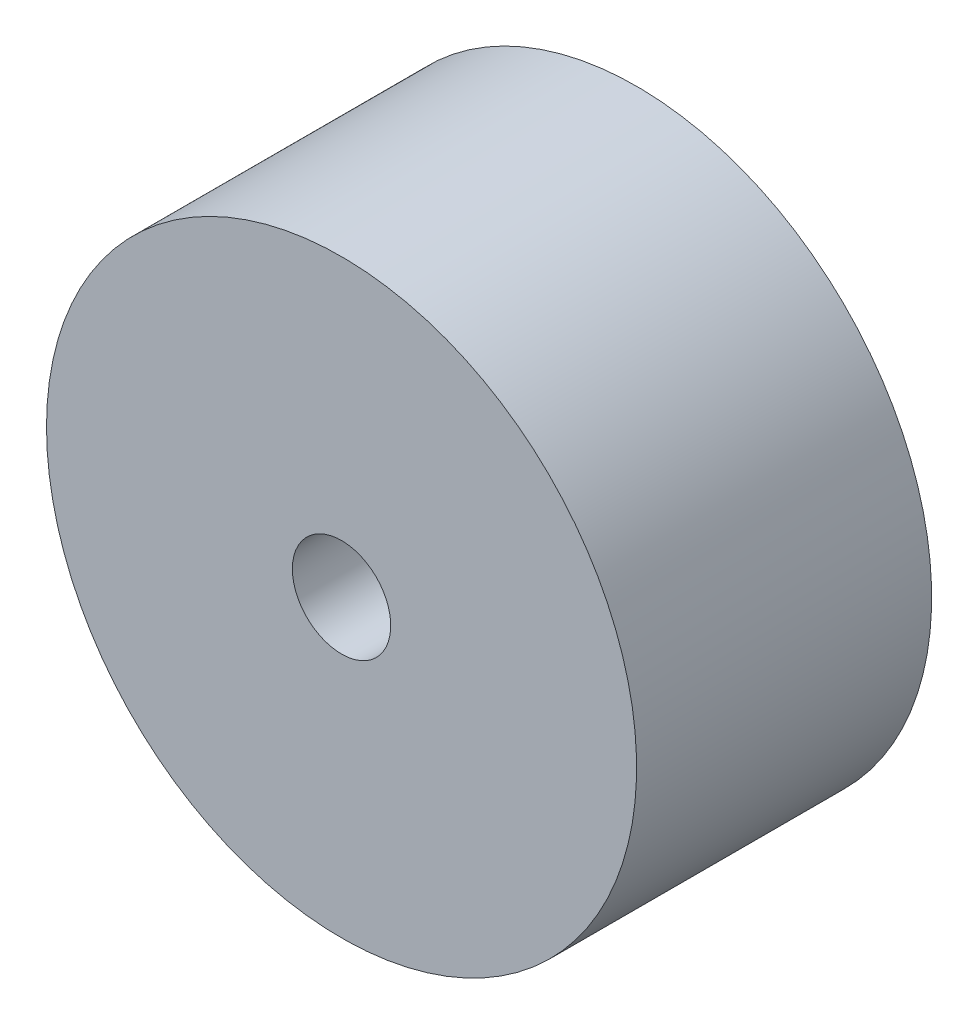
ISO-10303-21;
HEADER;
FILE_DESCRIPTION(('STEP AP214'),'2;1');
FILE_NAME('part.step','',(''),(''),'','','');
FILE_SCHEMA(('AUTOMOTIVE_DESIGN { 1 0 10303 214 1 1 1 1 }'));
ENDSEC;
DATA;
#1=APPLICATION_CONTEXT('core data for automotive mechanical design processes');
#2=APPLICATION_PROTOCOL_DEFINITION('international standard','automotive_design',2000,#1);
#3=PRODUCT_CONTEXT('',#1,'mechanical');
#4=PRODUCT('Part','Part','',(#3));
#5=PRODUCT_RELATED_PRODUCT_CATEGORY('part','',(#4));
#6=PRODUCT_DEFINITION_FORMATION('','',#4);
#7=PRODUCT_DEFINITION_CONTEXT('part definition',#1,'design');
#8=PRODUCT_DEFINITION('design','',#6,#7);
#9=PRODUCT_DEFINITION_SHAPE('','',#8);
#10=(LENGTH_UNIT() NAMED_UNIT(*) SI_UNIT(.MILLI.,.METRE.));
#11=(NAMED_UNIT(*) PLANE_ANGLE_UNIT() SI_UNIT($,.RADIAN.));
#12=(NAMED_UNIT(*) SI_UNIT($,.STERADIAN.) SOLID_ANGLE_UNIT());
#13=UNCERTAINTY_MEASURE_WITH_UNIT(LENGTH_MEASURE(1.E-05),#10,'distance_accuracy_value','');
#14=(GEOMETRIC_REPRESENTATION_CONTEXT(3) GLOBAL_UNCERTAINTY_ASSIGNED_CONTEXT((#13)) GLOBAL_UNIT_ASSIGNED_CONTEXT((#10,
#11,#12)) REPRESENTATION_CONTEXT('',''));
#15=CARTESIAN_POINT('',(0.,0.,0.));
#16=DIRECTION('',(0.,0.,1.));
#17=DIRECTION('',(1.,0.,0.));
#18=AXIS2_PLACEMENT_3D('',#15,#16,#17);
#19=CARTESIAN_POINT('',(0.,0.,38.1));
#20=DIRECTION('',(0.,0.,1.));
#21=DIRECTION('',(1.,0.,0.));
#22=AXIS2_PLACEMENT_3D('',#19,#20,#21);
#23=PLANE('',#22);
#24=CARTESIAN_POINT('',(0.,0.,38.1));
#25=DIRECTION('',(0.,0.,1.));
#26=DIRECTION('',(1.,0.,0.));
#27=AXIS2_PLACEMENT_3D('',#24,#25,#26);
#28=CIRCLE('',#27,38.1);
#29=CARTESIAN_POINT('',(-38.1,0.,38.1));
#30=VERTEX_POINT('',#29);
#31=EDGE_CURVE('E10',#30,#30,#28,.T.);
#32=ORIENTED_EDGE('',*,*,#31,.T.);
#33=EDGE_LOOP('',(#32));
#34=FACE_BOUND('',#33,.T.);
#35=CARTESIAN_POINT('',(0.,0.,38.1));
#36=DIRECTION('',(0.,0.,1.));
#37=DIRECTION('',(1.,0.,0.));
#38=AXIS2_PLACEMENT_3D('',#35,#36,#37);
#39=CIRCLE('',#38,6.35);
#40=CARTESIAN_POINT('',(-6.35,0.,38.1));
#41=VERTEX_POINT('',#40);
#42=EDGE_CURVE('E47',#41,#41,#39,.T.);
#43=ORIENTED_EDGE('',*,*,#42,.F.);
#44=EDGE_LOOP('',(#43));
#45=FACE_BOUND('',#44,.T.);
#46=ADVANCED_FACE('F36',(#34,#45),#23,.T.);
#47=CARTESIAN_POINT('',(0.,0.,0.));
#48=DIRECTION('',(0.,0.,1.));
#49=DIRECTION('',(1.,0.,0.));
#50=AXIS2_PLACEMENT_3D('',#47,#48,#49);
#51=PLANE('',#50);
#52=CARTESIAN_POINT('',(0.,0.,0.));
#53=DIRECTION('',(0.,0.,1.));
#54=DIRECTION('',(1.,0.,0.));
#55=AXIS2_PLACEMENT_3D('',#52,#53,#54);
#56=CIRCLE('',#55,38.1);
#57=CARTESIAN_POINT('',(-38.1,0.,0.));
#58=VERTEX_POINT('',#57);
#59=EDGE_CURVE('E40',#58,#58,#56,.T.);
#60=ORIENTED_EDGE('',*,*,#59,.F.);
#61=EDGE_LOOP('',(#60));
#62=FACE_BOUND('',#61,.T.);
#63=CARTESIAN_POINT('',(0.,0.,0.));
#64=DIRECTION('',(0.,0.,1.));
#65=DIRECTION('',(1.,0.,0.));
#66=AXIS2_PLACEMENT_3D('',#63,#64,#65);
#67=CIRCLE('',#66,6.35);
#68=CARTESIAN_POINT('',(-6.35,0.,0.));
#69=VERTEX_POINT('',#68);
#70=EDGE_CURVE('E49',#69,#69,#67,.T.);
#71=ORIENTED_EDGE('',*,*,#70,.T.);
#72=EDGE_LOOP('',(#71));
#73=FACE_BOUND('',#72,.T.);
#74=ADVANCED_FACE('F59',(#62,#73),#51,.F.);
#75=CARTESIAN_POINT('',(0.,0.,38.1));
#76=DIRECTION('',(0.,0.,-1.));
#77=DIRECTION('',(-1.,0.,0.));
#78=AXIS2_PLACEMENT_3D('',#75,#76,#77);
#79=CYLINDRICAL_SURFACE('',#78,38.1);
#80=CARTESIAN_POINT('',(-38.1,0.,38.1));
#81=CARTESIAN_POINT('',(-38.1,0.,37.703125));
#82=CARTESIAN_POINT('',(-38.1,0.,37.30625));
#83=CARTESIAN_POINT('',(-38.1,0.,36.5125));
#84=CARTESIAN_POINT('',(-38.1,0.,36.115625));
#85=CARTESIAN_POINT('',(-38.1,0.,35.321875));
#86=CARTESIAN_POINT('',(-38.1,0.,34.925));
#87=CARTESIAN_POINT('',(-38.1,0.,34.13125));
#88=CARTESIAN_POINT('',(-38.1,0.,33.734375));
#89=CARTESIAN_POINT('',(-38.1,0.,32.940625));
#90=CARTESIAN_POINT('',(-38.1,0.,32.54375));
#91=CARTESIAN_POINT('',(-38.1,0.,31.75));
#92=CARTESIAN_POINT('',(-38.1,0.,31.353125));
#93=CARTESIAN_POINT('',(-38.1,0.,30.559375));
#94=CARTESIAN_POINT('',(-38.1,0.,30.1625));
#95=CARTESIAN_POINT('',(-38.1,0.,29.36875));
#96=CARTESIAN_POINT('',(-38.1,0.,28.971875));
#97=CARTESIAN_POINT('',(-38.1,0.,28.178125));
#98=CARTESIAN_POINT('',(-38.1,0.,27.78125));
#99=CARTESIAN_POINT('',(-38.1,0.,26.9875));
#100=CARTESIAN_POINT('',(-38.1,0.,26.590625));
#101=CARTESIAN_POINT('',(-38.1,0.,25.796875));
#102=CARTESIAN_POINT('',(-38.1,0.,25.4));
#103=CARTESIAN_POINT('',(-38.1,0.,24.60625));
#104=CARTESIAN_POINT('',(-38.1,0.,24.209375));
#105=CARTESIAN_POINT('',(-38.1,0.,23.415625));
#106=CARTESIAN_POINT('',(-38.1,0.,23.01875));
#107=CARTESIAN_POINT('',(-38.1,0.,22.225));
#108=CARTESIAN_POINT('',(-38.1,0.,21.828125));
#109=CARTESIAN_POINT('',(-38.1,0.,21.034375));
#110=CARTESIAN_POINT('',(-38.1,0.,20.6375));
#111=CARTESIAN_POINT('',(-38.1,0.,19.84375));
#112=CARTESIAN_POINT('',(-38.1,0.,19.446875));
#113=CARTESIAN_POINT('',(-38.1,0.,18.653125));
#114=CARTESIAN_POINT('',(-38.1,0.,18.25625));
#115=CARTESIAN_POINT('',(-38.1,0.,17.4625));
#116=CARTESIAN_POINT('',(-38.1,0.,17.065625));
#117=CARTESIAN_POINT('',(-38.1,0.,16.271875));
#118=CARTESIAN_POINT('',(-38.1,0.,15.875));
#119=CARTESIAN_POINT('',(-38.1,0.,15.08125));
#120=CARTESIAN_POINT('',(-38.1,0.,14.684375));
#121=CARTESIAN_POINT('',(-38.1,0.,13.890625));
#122=CARTESIAN_POINT('',(-38.1,0.,13.49375));
#123=CARTESIAN_POINT('',(-38.1,0.,12.7));
#124=CARTESIAN_POINT('',(-38.1,0.,12.303125));
#125=CARTESIAN_POINT('',(-38.1,0.,11.509375));
#126=CARTESIAN_POINT('',(-38.1,0.,11.1125));
#127=CARTESIAN_POINT('',(-38.1,0.,10.31875));
#128=CARTESIAN_POINT('',(-38.1,0.,9.92187499999999));
#129=CARTESIAN_POINT('',(-38.1,0.,9.128125));
#130=CARTESIAN_POINT('',(-38.1,0.,8.73124999999999));
#131=CARTESIAN_POINT('',(-38.1,0.,7.93749999999999));
#132=CARTESIAN_POINT('',(-38.1,0.,7.54062499999999));
#133=CARTESIAN_POINT('',(-38.1,0.,6.746875));
#134=CARTESIAN_POINT('',(-38.1,0.,6.35));
#135=CARTESIAN_POINT('',(-38.1,0.,5.55625));
#136=CARTESIAN_POINT('',(-38.1,0.,5.159375));
#137=CARTESIAN_POINT('',(-38.1,0.,4.365625));
#138=CARTESIAN_POINT('',(-38.1,0.,3.96875));
#139=CARTESIAN_POINT('',(-38.1,0.,3.175));
#140=CARTESIAN_POINT('',(-38.1,0.,2.778125));
#141=CARTESIAN_POINT('',(-38.1,0.,1.984375));
#142=CARTESIAN_POINT('',(-38.1,0.,1.5875));
#143=CARTESIAN_POINT('',(-38.1,0.,0.79375));
#144=CARTESIAN_POINT('',(-38.1,0.,0.396875));
#145=CARTESIAN_POINT('',(-38.1,0.,0.));
#146=B_SPLINE_CURVE_WITH_KNOTS('',3,(#80,#81,#82,#83,#84,#85,#86,#87,#88,#89,#90,#91,#92,#93,
#94,#95,#96,#97,#98,#99,#100,#101,#102,#103,#104,#105,#106,#107,#108,#109,#110,#111,#112,#113,
#114,#115,#116,#117,#118,#119,#120,#121,#122,#123,#124,#125,#126,#127,#128,#129,#130,#131,#132,
#133,#134,#135,#136,#137,#138,#139,#140,#141,#142,#143,#144,#145),.UNSPECIFIED.,.F.,.F.,(4,2,2,
2,2,2,2,2,2,2,2,2,2,2,2,2,2,2,2,2,2,2,2,2,2,2,2,2,2,2,2,2,4),(0.,1.190625,2.38125,3.571875,
4.7625,5.953125,7.14375,8.334375,9.52500000000001,10.715625,11.90625,13.096875,14.2875,
15.478125,16.66875,17.859375,19.05,20.240625,21.43125,22.621875,23.8125,25.003125,26.19375,
27.384375,28.575,29.765625,30.95625,32.146875,33.3375,34.528125,35.71875,36.909375,38.1),.UNSPECIFIED.);
#147=EDGE_CURVE('BSEAM38',#30,#58,#146,.T.);
#148=ORIENTED_EDGE('',*,*,#31,.F.);
#149=ORIENTED_EDGE('',*,*,#59,.T.);
#150=ORIENTED_EDGE('',*,*,#147,.T.);
#151=ORIENTED_EDGE('',*,*,#147,.F.);
#152=EDGE_LOOP('',(#148,#150,#149,#151));
#153=FACE_BOUND('',#152,.T.);
#154=ADVANCED_FACE('F38',(#153),#79,.T.);
#155=CARTESIAN_POINT('',(0.,0.,38.1));
#156=DIRECTION('',(0.,0.,-1.));
#157=DIRECTION('',(-1.,0.,0.));
#158=AXIS2_PLACEMENT_3D('',#155,#156,#157);
#159=CYLINDRICAL_SURFACE('',#158,6.35);
#160=CARTESIAN_POINT('',(-6.35,0.,38.1));
#161=CARTESIAN_POINT('',(-6.35,0.,37.703125));
#162=CARTESIAN_POINT('',(-6.35,0.,37.30625));
#163=CARTESIAN_POINT('',(-6.35,0.,36.5125));
#164=CARTESIAN_POINT('',(-6.35,0.,36.115625));
#165=CARTESIAN_POINT('',(-6.35,0.,35.321875));
#166=CARTESIAN_POINT('',(-6.35,0.,34.925));
#167=CARTESIAN_POINT('',(-6.35,0.,34.13125));
#168=CARTESIAN_POINT('',(-6.35,0.,33.734375));
#169=CARTESIAN_POINT('',(-6.35,0.,32.940625));
#170=CARTESIAN_POINT('',(-6.35,0.,32.54375));
#171=CARTESIAN_POINT('',(-6.35,0.,31.75));
#172=CARTESIAN_POINT('',(-6.35,0.,31.353125));
#173=CARTESIAN_POINT('',(-6.35,0.,30.559375));
#174=CARTESIAN_POINT('',(-6.35,0.,30.1625));
#175=CARTESIAN_POINT('',(-6.35,0.,29.36875));
#176=CARTESIAN_POINT('',(-6.35,0.,28.971875));
#177=CARTESIAN_POINT('',(-6.35,0.,28.178125));
#178=CARTESIAN_POINT('',(-6.35,0.,27.78125));
#179=CARTESIAN_POINT('',(-6.35,0.,26.9875));
#180=CARTESIAN_POINT('',(-6.35,0.,26.590625));
#181=CARTESIAN_POINT('',(-6.35,0.,25.796875));
#182=CARTESIAN_POINT('',(-6.35,0.,25.4));
#183=CARTESIAN_POINT('',(-6.35,0.,24.60625));
#184=CARTESIAN_POINT('',(-6.35,0.,24.209375));
#185=CARTESIAN_POINT('',(-6.35,0.,23.415625));
#186=CARTESIAN_POINT('',(-6.35,0.,23.01875));
#187=CARTESIAN_POINT('',(-6.35,0.,22.225));
#188=CARTESIAN_POINT('',(-6.35,0.,21.828125));
#189=CARTESIAN_POINT('',(-6.35,0.,21.034375));
#190=CARTESIAN_POINT('',(-6.35,0.,20.6375));
#191=CARTESIAN_POINT('',(-6.35,0.,19.84375));
#192=CARTESIAN_POINT('',(-6.35,0.,19.446875));
#193=CARTESIAN_POINT('',(-6.35,0.,18.653125));
#194=CARTESIAN_POINT('',(-6.35,0.,18.25625));
#195=CARTESIAN_POINT('',(-6.35,0.,17.4625));
#196=CARTESIAN_POINT('',(-6.35,0.,17.065625));
#197=CARTESIAN_POINT('',(-6.35,0.,16.271875));
#198=CARTESIAN_POINT('',(-6.35,0.,15.875));
#199=CARTESIAN_POINT('',(-6.35,0.,15.08125));
#200=CARTESIAN_POINT('',(-6.35,0.,14.684375));
#201=CARTESIAN_POINT('',(-6.35,0.,13.890625));
#202=CARTESIAN_POINT('',(-6.35,0.,13.49375));
#203=CARTESIAN_POINT('',(-6.35,0.,12.7));
#204=CARTESIAN_POINT('',(-6.35,0.,12.303125));
#205=CARTESIAN_POINT('',(-6.35,0.,11.509375));
#206=CARTESIAN_POINT('',(-6.35,0.,11.1125));
#207=CARTESIAN_POINT('',(-6.35,0.,10.31875));
#208=CARTESIAN_POINT('',(-6.35,0.,9.921875));
#209=CARTESIAN_POINT('',(-6.35,0.,9.128125));
#210=CARTESIAN_POINT('',(-6.35,0.,8.73125));
#211=CARTESIAN_POINT('',(-6.35,0.,7.9375));
#212=CARTESIAN_POINT('',(-6.35,0.,7.540625));
#213=CARTESIAN_POINT('',(-6.35,0.,6.746875));
#214=CARTESIAN_POINT('',(-6.35,0.,6.35));
#215=CARTESIAN_POINT('',(-6.35,0.,5.55625));
#216=CARTESIAN_POINT('',(-6.35,0.,5.159375));
#217=CARTESIAN_POINT('',(-6.35,0.,4.365625));
#218=CARTESIAN_POINT('',(-6.35,0.,3.96875));
#219=CARTESIAN_POINT('',(-6.35,0.,3.175));
#220=CARTESIAN_POINT('',(-6.35,0.,2.778125));
#221=CARTESIAN_POINT('',(-6.35,0.,1.984375));
#222=CARTESIAN_POINT('',(-6.35,0.,1.5875));
#223=CARTESIAN_POINT('',(-6.35,0.,0.79375));
#224=CARTESIAN_POINT('',(-6.35,0.,0.396875));
#225=CARTESIAN_POINT('',(-6.35,0.,0.));
#226=B_SPLINE_CURVE_WITH_KNOTS('',3,(#160,#161,#162,#163,#164,#165,#166,#167,#168,#169,#170,
#171,#172,#173,#174,#175,#176,#177,#178,#179,#180,#181,#182,#183,#184,#185,#186,#187,#188,#189,
#190,#191,#192,#193,#194,#195,#196,#197,#198,#199,#200,#201,#202,#203,#204,#205,#206,#207,#208,
#209,#210,#211,#212,#213,#214,#215,#216,#217,#218,#219,#220,#221,#222,#223,#224,#225),
.UNSPECIFIED.,.F.,.F.,(4,2,2,2,2,2,2,2,2,2,2,2,2,2,2,2,2,2,2,2,2,2,2,2,2,2,2,2,2,2,2,2,4),(0.,
1.19062499999999,2.38124999999999,3.571875,4.7625,5.953125,7.14375,8.33437499999999,9.525,
10.715625,11.90625,13.096875,14.2875,15.478125,16.66875,17.859375,19.05,20.240625,21.43125,
22.621875,23.8125,25.003125,26.19375,27.384375,28.575,29.765625,30.95625,32.146875,33.3375,
34.528125,35.71875,36.909375,38.1),.UNSPECIFIED.);
#227=EDGE_CURVE('BSEAM55',#41,#69,#226,.T.);
#228=ORIENTED_EDGE('',*,*,#42,.T.);
#229=ORIENTED_EDGE('',*,*,#70,.F.);
#230=ORIENTED_EDGE('',*,*,#227,.T.);
#231=ORIENTED_EDGE('',*,*,#227,.F.);
#232=EDGE_LOOP('',(#228,#230,#229,#231));
#233=FACE_BOUND('',#232,.T.);
#234=ADVANCED_FACE('F55',(#233),#159,.F.);
#235=CLOSED_SHELL('',(#46,#74,#154,#234));
#236=MANIFOLD_SOLID_BREP('B2',#235);
#237=ADVANCED_BREP_SHAPE_REPRESENTATION('',(#18,#236),#14);
#238=SHAPE_DEFINITION_REPRESENTATION(#9,#237);
ENDSEC;
END-ISO-10303-21;
